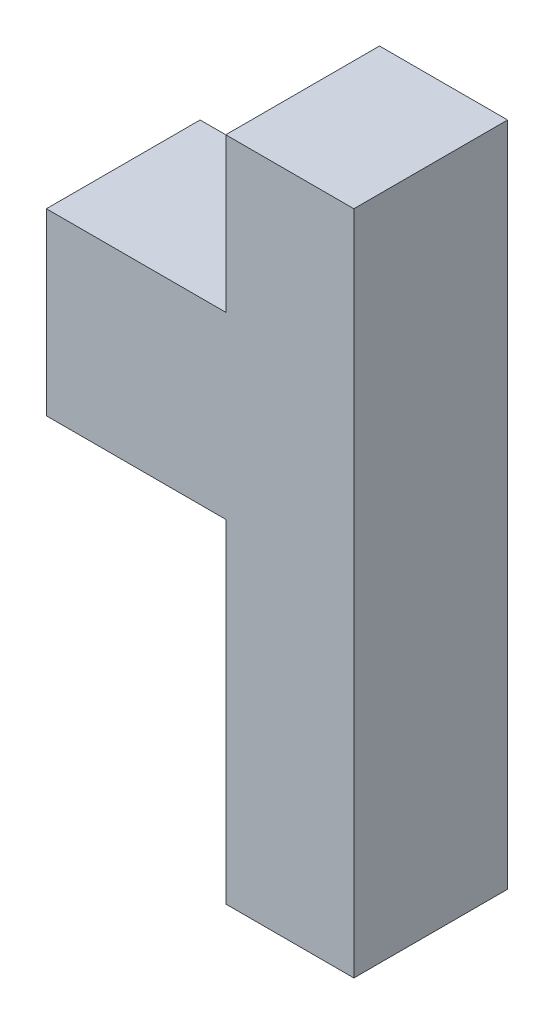
ISO-10303-21;
HEADER;
FILE_DESCRIPTION(('STEP AP214'),'2;1');
FILE_NAME('part.step','',(''),(''),'','','');
FILE_SCHEMA(('AUTOMOTIVE_DESIGN { 1 0 10303 214 1 1 1 1 }'));
ENDSEC;
DATA;
#1=APPLICATION_CONTEXT('core data for automotive mechanical design processes');
#2=APPLICATION_PROTOCOL_DEFINITION('international standard','automotive_design',2000,#1);
#3=PRODUCT_CONTEXT('',#1,'mechanical');
#4=PRODUCT('Part','Part','',(#3));
#5=PRODUCT_RELATED_PRODUCT_CATEGORY('part','',(#4));
#6=PRODUCT_DEFINITION_FORMATION('','',#4);
#7=PRODUCT_DEFINITION_CONTEXT('part definition',#1,'design');
#8=PRODUCT_DEFINITION('design','',#6,#7);
#9=PRODUCT_DEFINITION_SHAPE('','',#8);
#10=(LENGTH_UNIT() NAMED_UNIT(*) SI_UNIT(.MILLI.,.METRE.));
#11=(NAMED_UNIT(*) PLANE_ANGLE_UNIT() SI_UNIT($,.RADIAN.));
#12=(NAMED_UNIT(*) SI_UNIT($,.STERADIAN.) SOLID_ANGLE_UNIT());
#13=UNCERTAINTY_MEASURE_WITH_UNIT(LENGTH_MEASURE(1.E-05),#10,'distance_accuracy_value','');
#14=(GEOMETRIC_REPRESENTATION_CONTEXT(3) GLOBAL_UNCERTAINTY_ASSIGNED_CONTEXT((#13)) GLOBAL_UNIT_ASSIGNED_CONTEXT((#10,
#11,#12)) REPRESENTATION_CONTEXT('',''));
#15=CARTESIAN_POINT('',(0.,0.,0.));
#16=DIRECTION('',(0.,0.,1.));
#17=DIRECTION('',(1.,0.,0.));
#18=AXIS2_PLACEMENT_3D('',#15,#16,#17);
#19=CARTESIAN_POINT('',(12.5,70.,30.));
#20=DIRECTION('',(-1.,0.,0.));
#21=DIRECTION('',(0.,-1.,0.));
#22=AXIS2_PLACEMENT_3D('',#19,#20,#21);
#23=PLANE('',#22);
#24=DIRECTION('',(0.,1.,0.));
#25=VECTOR('',#24,1.);
#26=CARTESIAN_POINT('',(12.5,70.,30.));
#27=LINE('',#26,#25);
#28=CARTESIAN_POINT('',(12.5,-60.,30.));
#29=VERTEX_POINT('',#28);
#30=CARTESIAN_POINT('',(12.5,70.,30.));
#31=VERTEX_POINT('',#30);
#32=EDGE_CURVE('E191',#29,#31,#27,.T.);
#33=ORIENTED_EDGE('',*,*,#32,.F.);
#34=DIRECTION('',(0.,0.,-1.));
#35=VECTOR('',#34,1.);
#36=CARTESIAN_POINT('',(12.5,-60.,30.));
#37=LINE('',#36,#35);
#38=CARTESIAN_POINT('',(12.5,-60.,0.));
#39=VERTEX_POINT('',#38);
#40=EDGE_CURVE('E184',#29,#39,#37,.T.);
#41=ORIENTED_EDGE('',*,*,#40,.T.);
#42=DIRECTION('',(0.,1.,0.));
#43=VECTOR('',#42,1.);
#44=CARTESIAN_POINT('',(12.5,70.,0.));
#45=LINE('',#44,#43);
#46=CARTESIAN_POINT('',(12.5,70.,0.));
#47=VERTEX_POINT('',#46);
#48=EDGE_CURVE('E190',#39,#47,#45,.T.);
#49=ORIENTED_EDGE('',*,*,#48,.T.);
#50=DIRECTION('',(0.,0.,-1.));
#51=VECTOR('',#50,1.);
#52=CARTESIAN_POINT('',(12.5,70.,30.));
#53=LINE('',#52,#51);
#54=EDGE_CURVE('E235',#31,#47,#53,.T.);
#55=ORIENTED_EDGE('',*,*,#54,.F.);
#56=EDGE_LOOP('',(#33,#41,#49,#55));
#57=FACE_BOUND('',#56,.T.);
#58=ADVANCED_FACE('F33',(#57),#23,.F.);
#59=CARTESIAN_POINT('',(-12.5,70.,30.));
#60=DIRECTION('',(0.,-1.,0.));
#61=DIRECTION('',(0.,0.,-1.));
#62=AXIS2_PLACEMENT_3D('',#59,#60,#61);
#63=PLANE('',#62);
#64=DIRECTION('',(-1.,0.,0.));
#65=VECTOR('',#64,1.);
#66=CARTESIAN_POINT('',(-12.5,70.,0.));
#67=LINE('',#66,#65);
#68=CARTESIAN_POINT('',(-12.5,70.,0.));
#69=VERTEX_POINT('',#68);
#70=EDGE_CURVE('E209',#47,#69,#67,.T.);
#71=ORIENTED_EDGE('',*,*,#70,.T.);
#72=DIRECTION('',(0.,0.,-1.));
#73=VECTOR('',#72,1.);
#74=CARTESIAN_POINT('',(-12.5,70.,30.));
#75=LINE('',#74,#73);
#76=CARTESIAN_POINT('',(-12.5,70.,30.));
#77=VERTEX_POINT('',#76);
#78=EDGE_CURVE('E232',#77,#69,#75,.T.);
#79=ORIENTED_EDGE('',*,*,#78,.F.);
#80=DIRECTION('',(-1.,0.,0.));
#81=VECTOR('',#80,1.);
#82=CARTESIAN_POINT('',(-12.5,70.,30.));
#83=LINE('',#82,#81);
#84=EDGE_CURVE('E193',#31,#77,#83,.T.);
#85=ORIENTED_EDGE('',*,*,#84,.F.);
#86=ORIENTED_EDGE('',*,*,#54,.T.);
#87=EDGE_LOOP('',(#71,#79,#85,#86));
#88=FACE_BOUND('',#87,.T.);
#89=ADVANCED_FACE('F268',(#88),#63,.F.);
#90=CARTESIAN_POINT('',(-12.5,70.,30.));
#91=DIRECTION('',(1.,0.,0.));
#92=DIRECTION('',(0.,1.,0.));
#93=AXIS2_PLACEMENT_3D('',#90,#91,#92);
#94=PLANE('',#93);
#95=DIRECTION('',(0.,-1.,0.));
#96=VECTOR('',#95,1.);
#97=CARTESIAN_POINT('',(-12.5,70.,0.));
#98=LINE('',#97,#96);
#99=CARTESIAN_POINT('',(-12.5,40.,0.));
#100=VERTEX_POINT('',#99);
#101=EDGE_CURVE('E211',#69,#100,#98,.T.);
#102=ORIENTED_EDGE('',*,*,#101,.T.);
#103=DIRECTION('',(0.,0.,-1.));
#104=VECTOR('',#103,1.);
#105=CARTESIAN_POINT('',(-12.5,40.,30.));
#106=LINE('',#105,#104);
#107=CARTESIAN_POINT('',(-12.5,40.,30.));
#108=VERTEX_POINT('',#107);
#109=EDGE_CURVE('E229',#108,#100,#106,.T.);
#110=ORIENTED_EDGE('',*,*,#109,.F.);
#111=DIRECTION('',(0.,-1.,0.));
#112=VECTOR('',#111,1.);
#113=CARTESIAN_POINT('',(-12.5,70.,30.));
#114=LINE('',#113,#112);
#115=EDGE_CURVE('E196',#77,#108,#114,.T.);
#116=ORIENTED_EDGE('',*,*,#115,.F.);
#117=ORIENTED_EDGE('',*,*,#78,.T.);
#118=EDGE_LOOP('',(#102,#110,#116,#117));
#119=FACE_BOUND('',#118,.T.);
#120=ADVANCED_FACE('F274',(#119),#94,.F.);
#121=CARTESIAN_POINT('',(-47.5,40.,30.));
#122=DIRECTION('',(0.,-1.,0.));
#123=DIRECTION('',(0.,0.,-1.));
#124=AXIS2_PLACEMENT_3D('',#121,#122,#123);
#125=PLANE('',#124);
#126=DIRECTION('',(-1.,0.,0.));
#127=VECTOR('',#126,1.);
#128=CARTESIAN_POINT('',(-47.5,40.,0.));
#129=LINE('',#128,#127);
#130=CARTESIAN_POINT('',(-47.5,40.,0.));
#131=VERTEX_POINT('',#130);
#132=EDGE_CURVE('E213',#100,#131,#129,.T.);
#133=ORIENTED_EDGE('',*,*,#132,.T.);
#134=DIRECTION('',(0.,0.,-1.));
#135=VECTOR('',#134,1.);
#136=CARTESIAN_POINT('',(-47.5,40.,30.));
#137=LINE('',#136,#135);
#138=CARTESIAN_POINT('',(-47.5,40.,30.));
#139=VERTEX_POINT('',#138);
#140=EDGE_CURVE('E226',#139,#131,#137,.T.);
#141=ORIENTED_EDGE('',*,*,#140,.F.);
#142=DIRECTION('',(-1.,0.,0.));
#143=VECTOR('',#142,1.);
#144=CARTESIAN_POINT('',(-47.5,40.,30.));
#145=LINE('',#144,#143);
#146=EDGE_CURVE('E198',#108,#139,#145,.T.);
#147=ORIENTED_EDGE('',*,*,#146,.F.);
#148=ORIENTED_EDGE('',*,*,#109,.T.);
#149=EDGE_LOOP('',(#133,#141,#147,#148));
#150=FACE_BOUND('',#149,.T.);
#151=ADVANCED_FACE('F323',(#150),#125,.F.);
#152=CARTESIAN_POINT('',(-47.5,40.,30.));
#153=DIRECTION('',(1.,0.,0.));
#154=DIRECTION('',(0.,1.,0.));
#155=AXIS2_PLACEMENT_3D('',#152,#153,#154);
#156=PLANE('',#155);
#157=DIRECTION('',(0.,-1.,0.));
#158=VECTOR('',#157,1.);
#159=CARTESIAN_POINT('',(-47.5,40.,0.));
#160=LINE('',#159,#158);
#161=CARTESIAN_POINT('',(-47.5,4.99999999999999,0.));
#162=VERTEX_POINT('',#161);
#163=EDGE_CURVE('E215',#131,#162,#160,.T.);
#164=ORIENTED_EDGE('',*,*,#163,.T.);
#165=DIRECTION('',(0.,0.,-1.));
#166=VECTOR('',#165,1.);
#167=CARTESIAN_POINT('',(-47.5,4.99999999999999,30.));
#168=LINE('',#167,#166);
#169=CARTESIAN_POINT('',(-47.5,4.99999999999999,30.));
#170=VERTEX_POINT('',#169);
#171=EDGE_CURVE('E223',#170,#162,#168,.T.);
#172=ORIENTED_EDGE('',*,*,#171,.F.);
#173=DIRECTION('',(0.,-1.,0.));
#174=VECTOR('',#173,1.);
#175=CARTESIAN_POINT('',(-47.5,40.,30.));
#176=LINE('',#175,#174);
#177=EDGE_CURVE('E200',#139,#170,#176,.T.);
#178=ORIENTED_EDGE('',*,*,#177,.F.);
#179=ORIENTED_EDGE('',*,*,#140,.T.);
#180=EDGE_LOOP('',(#164,#172,#178,#179));
#181=FACE_BOUND('',#180,.T.);
#182=ADVANCED_FACE('F319',(#181),#156,.F.);
#183=CARTESIAN_POINT('',(-47.5,4.99999999999999,30.));
#184=DIRECTION('',(0.,1.,0.));
#185=DIRECTION('',(0.,0.,1.));
#186=AXIS2_PLACEMENT_3D('',#183,#184,#185);
#187=PLANE('',#186);
#188=DIRECTION('',(1.,0.,0.));
#189=VECTOR('',#188,1.);
#190=CARTESIAN_POINT('',(-47.5,4.99999999999999,0.));
#191=LINE('',#190,#189);
#192=CARTESIAN_POINT('',(-12.5,4.99999999999999,0.));
#193=VERTEX_POINT('',#192);
#194=EDGE_CURVE('E217',#162,#193,#191,.T.);
#195=ORIENTED_EDGE('',*,*,#194,.T.);
#196=DIRECTION('',(0.,0.,-1.));
#197=VECTOR('',#196,1.);
#198=CARTESIAN_POINT('',(-12.5,4.99999999999999,30.));
#199=LINE('',#198,#197);
#200=CARTESIAN_POINT('',(-12.5,4.99999999999999,30.));
#201=VERTEX_POINT('',#200);
#202=EDGE_CURVE('E207',#201,#193,#199,.T.);
#203=ORIENTED_EDGE('',*,*,#202,.F.);
#204=DIRECTION('',(1.,0.,0.));
#205=VECTOR('',#204,1.);
#206=CARTESIAN_POINT('',(-47.5,4.99999999999999,30.));
#207=LINE('',#206,#205);
#208=EDGE_CURVE('E202',#170,#201,#207,.T.);
#209=ORIENTED_EDGE('',*,*,#208,.F.);
#210=ORIENTED_EDGE('',*,*,#171,.T.);
#211=EDGE_LOOP('',(#195,#203,#209,#210));
#212=FACE_BOUND('',#211,.T.);
#213=ADVANCED_FACE('F315',(#212),#187,.F.);
#214=CARTESIAN_POINT('',(-12.5,4.99999999999999,30.));
#215=DIRECTION('',(1.,0.,0.));
#216=DIRECTION('',(0.,1.,0.));
#217=AXIS2_PLACEMENT_3D('',#214,#215,#216);
#218=PLANE('',#217);
#219=DIRECTION('',(0.,-1.,0.));
#220=VECTOR('',#219,1.);
#221=CARTESIAN_POINT('',(-12.5,4.99999999999999,0.));
#222=LINE('',#221,#220);
#223=CARTESIAN_POINT('',(-12.5,-60.,0.));
#224=VERTEX_POINT('',#223);
#225=EDGE_CURVE('E194',#193,#224,#222,.T.);
#226=ORIENTED_EDGE('',*,*,#225,.T.);
#227=DIRECTION('',(0.,0.,1.));
#228=VECTOR('',#227,1.);
#229=CARTESIAN_POINT('',(-12.5,-60.,30.));
#230=LINE('',#229,#228);
#231=CARTESIAN_POINT('',(-12.5,-60.,30.));
#232=VERTEX_POINT('',#231);
#233=EDGE_CURVE('E156',#224,#232,#230,.T.);
#234=ORIENTED_EDGE('',*,*,#233,.T.);
#235=DIRECTION('',(0.,-1.,0.));
#236=VECTOR('',#235,1.);
#237=CARTESIAN_POINT('',(-12.5,4.99999999999999,30.));
#238=LINE('',#237,#236);
#239=EDGE_CURVE('E204',#201,#232,#238,.T.);
#240=ORIENTED_EDGE('',*,*,#239,.F.);
#241=ORIENTED_EDGE('',*,*,#202,.T.);
#242=EDGE_LOOP('',(#226,#234,#240,#241));
#243=FACE_BOUND('',#242,.T.);
#244=ADVANCED_FACE('F308',(#243),#218,.F.);
#245=CARTESIAN_POINT('',(0.,0.,30.));
#246=DIRECTION('',(0.,0.,1.));
#247=DIRECTION('',(1.,0.,0.));
#248=AXIS2_PLACEMENT_3D('',#245,#246,#247);
#249=PLANE('',#248);
#250=DIRECTION('',(1.,0.,0.));
#251=VECTOR('',#250,1.);
#252=CARTESIAN_POINT('',(-12.5,-60.,30.));
#253=LINE('',#252,#251);
#254=EDGE_CURVE('E181',#232,#29,#253,.T.);
#255=ORIENTED_EDGE('',*,*,#254,.T.);
#256=ORIENTED_EDGE('',*,*,#32,.T.);
#257=ORIENTED_EDGE('',*,*,#84,.T.);
#258=ORIENTED_EDGE('',*,*,#115,.T.);
#259=ORIENTED_EDGE('',*,*,#146,.T.);
#260=ORIENTED_EDGE('',*,*,#177,.T.);
#261=ORIENTED_EDGE('',*,*,#208,.T.);
#262=ORIENTED_EDGE('',*,*,#239,.T.);
#263=EDGE_LOOP('',(#255,#256,#257,#258,#259,#260,#261,#262));
#264=FACE_BOUND('',#263,.T.);
#265=ADVANCED_FACE('F305',(#264),#249,.T.);
#266=CARTESIAN_POINT('',(0.,0.,0.));
#267=DIRECTION('',(0.,0.,1.));
#268=DIRECTION('',(1.,0.,0.));
#269=AXIS2_PLACEMENT_3D('',#266,#267,#268);
#270=PLANE('',#269);
#271=ORIENTED_EDGE('',*,*,#48,.F.);
#272=DIRECTION('',(-1.,0.,0.));
#273=VECTOR('',#272,1.);
#274=CARTESIAN_POINT('',(-12.5,-60.,0.));
#275=LINE('',#274,#273);
#276=EDGE_CURVE('E187',#39,#224,#275,.T.);
#277=ORIENTED_EDGE('',*,*,#276,.T.);
#278=ORIENTED_EDGE('',*,*,#225,.F.);
#279=ORIENTED_EDGE('',*,*,#194,.F.);
#280=ORIENTED_EDGE('',*,*,#163,.F.);
#281=ORIENTED_EDGE('',*,*,#132,.F.);
#282=ORIENTED_EDGE('',*,*,#101,.F.);
#283=ORIENTED_EDGE('',*,*,#70,.F.);
#284=EDGE_LOOP('',(#271,#277,#278,#279,#280,#281,#282,#283));
#285=FACE_BOUND('',#284,.T.);
#286=ADVANCED_FACE('F301',(#285),#270,.F.);
#287=CARTESIAN_POINT('',(0.,-60.,0.));
#288=DIRECTION('',(0.,1.,0.));
#289=DIRECTION('',(0.,0.,1.));
#290=AXIS2_PLACEMENT_3D('',#287,#288,#289);
#291=PLANE('',#290);
#292=ORIENTED_EDGE('',*,*,#233,.F.);
#293=ORIENTED_EDGE('',*,*,#276,.F.);
#294=ORIENTED_EDGE('',*,*,#40,.F.);
#295=ORIENTED_EDGE('',*,*,#254,.F.);
#296=EDGE_LOOP('',(#292,#293,#294,#295));
#297=FACE_BOUND('',#296,.T.);
#298=DIRECTION('',(-1.,0.,0.));
#299=VECTOR('',#298,1.);
#300=CARTESIAN_POINT('',(-12.5,-60.,9.99999999999999));
#301=LINE('',#300,#299);
#302=CARTESIAN_POINT('',(2.50000000000001,-60.,9.99999999999999));
#303=VERTEX_POINT('',#302);
#304=CARTESIAN_POINT('',(-2.49999999999999,-60.,9.99999999999999));
#305=VERTEX_POINT('',#304);
#306=EDGE_CURVE('E140',#303,#305,#301,.T.);
#307=ORIENTED_EDGE('',*,*,#306,.T.);
#308=DIRECTION('',(0.,0.,1.));
#309=VECTOR('',#308,1.);
#310=CARTESIAN_POINT('',(-2.49999999999999,-60.,30.));
#311=LINE('',#310,#309);
#312=CARTESIAN_POINT('',(-2.49999999999999,-60.,20.));
#313=VERTEX_POINT('',#312);
#314=EDGE_CURVE('E162',#305,#313,#311,.T.);
#315=ORIENTED_EDGE('',*,*,#314,.T.);
#316=DIRECTION('',(1.,0.,0.));
#317=VECTOR('',#316,1.);
#318=CARTESIAN_POINT('',(-12.5,-60.,20.));
#319=LINE('',#318,#317);
#320=CARTESIAN_POINT('',(2.50000000000001,-60.,20.));
#321=VERTEX_POINT('',#320);
#322=EDGE_CURVE('E143',#313,#321,#319,.T.);
#323=ORIENTED_EDGE('',*,*,#322,.T.);
#324=DIRECTION('',(0.,0.,-1.));
#325=VECTOR('',#324,1.);
#326=CARTESIAN_POINT('',(2.50000000000001,-60.,30.));
#327=LINE('',#326,#325);
#328=EDGE_CURVE('E135',#321,#303,#327,.T.);
#329=ORIENTED_EDGE('',*,*,#328,.T.);
#330=EDGE_LOOP('',(#307,#315,#323,#329));
#331=FACE_BOUND('',#330,.T.);
#332=ADVANCED_FACE('F137',(#297,#331),#291,.F.);
#333=CARTESIAN_POINT('',(2.50000000000001,-60.,30.));
#334=DIRECTION('',(-1.,0.,0.));
#335=DIRECTION('',(0.,0.,1.));
#336=AXIS2_PLACEMENT_3D('',#333,#334,#335);
#337=PLANE('',#336);
#338=CARTESIAN_POINT('',(2.50000000000001,-65.,15.));
#339=DIRECTION('',(-1.,0.,0.));
#340=DIRECTION('',(0.,0.,1.));
#341=AXIS2_PLACEMENT_3D('',#338,#339,#340);
#342=CIRCLE('',#341,2.5);
#343=CARTESIAN_POINT('',(2.50000000000001,-65.,17.5));
#344=VERTEX_POINT('',#343);
#345=EDGE_CURVE('E171',#344,#344,#342,.F.);
#346=ORIENTED_EDGE('',*,*,#345,.F.);
#347=EDGE_LOOP('',(#346));
#348=FACE_BOUND('',#347,.T.);
#349=DIRECTION('',(0.,0.,-1.));
#350=VECTOR('',#349,1.);
#351=CARTESIAN_POINT('',(2.50000000000001,-70.,30.));
#352=LINE('',#351,#350);
#353=CARTESIAN_POINT('',(2.50000000000001,-70.,19.));
#354=VERTEX_POINT('',#353);
#355=CARTESIAN_POINT('',(2.50000000000001,-70.,11.));
#356=VERTEX_POINT('',#355);
#357=EDGE_CURVE('E169',#354,#356,#352,.T.);
#358=ORIENTED_EDGE('',*,*,#357,.T.);
#359=CARTESIAN_POINT('',(2.50000000000001,-69.,11.));
#360=DIRECTION('',(-1.,0.,0.));
#361=DIRECTION('',(0.,0.,1.));
#362=AXIS2_PLACEMENT_3D('',#359,#360,#361);
#363=CIRCLE('',#362,1.);
#364=CARTESIAN_POINT('',(2.50000000000001,-69.,9.99999999999999));
#365=VERTEX_POINT('',#364);
#366=EDGE_CURVE('E41',#356,#365,#363,.F.);
#367=ORIENTED_EDGE('',*,*,#366,.T.);
#368=DIRECTION('',(0.,-1.,0.));
#369=VECTOR('',#368,1.);
#370=CARTESIAN_POINT('',(2.50000000000001,-60.,9.99999999999999));
#371=LINE('',#370,#369);
#372=EDGE_CURVE('E150',#303,#365,#371,.T.);
#373=ORIENTED_EDGE('',*,*,#372,.F.);
#374=ORIENTED_EDGE('',*,*,#328,.F.);
#375=DIRECTION('',(0.,-1.,0.));
#376=VECTOR('',#375,1.);
#377=CARTESIAN_POINT('',(2.50000000000001,-60.,20.));
#378=LINE('',#377,#376);
#379=CARTESIAN_POINT('',(2.50000000000001,-69.,20.));
#380=VERTEX_POINT('',#379);
#381=EDGE_CURVE('E168',#321,#380,#378,.T.);
#382=ORIENTED_EDGE('',*,*,#381,.T.);
#383=CARTESIAN_POINT('',(2.50000000000001,-69.,19.));
#384=DIRECTION('',(-1.,0.,0.));
#385=DIRECTION('',(0.,0.,1.));
#386=AXIS2_PLACEMENT_3D('',#383,#384,#385);
#387=CIRCLE('',#386,1.);
#388=EDGE_CURVE('E48',#380,#354,#387,.F.);
#389=ORIENTED_EDGE('',*,*,#388,.T.);
#390=EDGE_LOOP('',(#358,#367,#373,#374,#382,#389));
#391=FACE_BOUND('',#390,.T.);
#392=ADVANCED_FACE('F151',(#348,#391),#337,.F.);
#393=CARTESIAN_POINT('',(-12.5,-60.,9.99999999999999));
#394=DIRECTION('',(0.,0.,1.));
#395=DIRECTION('',(1.,0.,0.));
#396=AXIS2_PLACEMENT_3D('',#393,#394,#395);
#397=PLANE('',#396);
#398=ORIENTED_EDGE('',*,*,#372,.T.);
#399=DIRECTION('',(-1.,0.,0.));
#400=VECTOR('',#399,1.);
#401=CARTESIAN_POINT('',(-12.5,-69.,9.99999999999999));
#402=LINE('',#401,#400);
#403=CARTESIAN_POINT('',(-2.49999999999999,-69.,9.99999999999999));
#404=VERTEX_POINT('',#403);
#405=EDGE_CURVE('E238',#365,#404,#402,.T.);
#406=ORIENTED_EDGE('',*,*,#405,.T.);
#407=DIRECTION('',(0.,-1.,0.));
#408=VECTOR('',#407,1.);
#409=CARTESIAN_POINT('',(-2.49999999999999,-60.,9.99999999999999));
#410=LINE('',#409,#408);
#411=EDGE_CURVE('E157',#305,#404,#410,.T.);
#412=ORIENTED_EDGE('',*,*,#411,.F.);
#413=ORIENTED_EDGE('',*,*,#306,.F.);
#414=EDGE_LOOP('',(#398,#406,#412,#413));
#415=FACE_BOUND('',#414,.T.);
#416=ADVANCED_FACE('F159',(#415),#397,.F.);
#417=CARTESIAN_POINT('',(-2.49999999999999,-60.,30.));
#418=DIRECTION('',(1.,0.,0.));
#419=DIRECTION('',(0.,0.,-1.));
#420=AXIS2_PLACEMENT_3D('',#417,#418,#419);
#421=PLANE('',#420);
#422=CARTESIAN_POINT('',(-2.49999999999999,-65.,15.));
#423=DIRECTION('',(1.,0.,0.));
#424=DIRECTION('',(0.,0.,-1.));
#425=AXIS2_PLACEMENT_3D('',#422,#423,#424);
#426=CIRCLE('',#425,2.5);
#427=CARTESIAN_POINT('',(-2.49999999999999,-65.,12.5));
#428=VERTEX_POINT('',#427);
#429=EDGE_CURVE('E239',#428,#428,#426,.F.);
#430=ORIENTED_EDGE('',*,*,#429,.F.);
#431=EDGE_LOOP('',(#430));
#432=FACE_BOUND('',#431,.T.);
#433=ORIENTED_EDGE('',*,*,#411,.T.);
#434=CARTESIAN_POINT('',(-2.49999999999999,-69.,11.));
#435=DIRECTION('',(1.,0.,0.));
#436=DIRECTION('',(0.,0.,-1.));
#437=AXIS2_PLACEMENT_3D('',#434,#435,#436);
#438=CIRCLE('',#437,1.);
#439=CARTESIAN_POINT('',(-2.49999999999999,-70.,11.));
#440=VERTEX_POINT('',#439);
#441=EDGE_CURVE('E245',#404,#440,#438,.F.);
#442=ORIENTED_EDGE('',*,*,#441,.T.);
#443=DIRECTION('',(0.,0.,1.));
#444=VECTOR('',#443,1.);
#445=CARTESIAN_POINT('',(-2.49999999999999,-70.,30.));
#446=LINE('',#445,#444);
#447=CARTESIAN_POINT('',(-2.49999999999999,-70.,19.));
#448=VERTEX_POINT('',#447);
#449=EDGE_CURVE('E147',#440,#448,#446,.T.);
#450=ORIENTED_EDGE('',*,*,#449,.T.);
#451=CARTESIAN_POINT('',(-2.49999999999999,-69.,19.));
#452=DIRECTION('',(1.,0.,0.));
#453=DIRECTION('',(0.,0.,-1.));
#454=AXIS2_PLACEMENT_3D('',#451,#452,#453);
#455=CIRCLE('',#454,1.);
#456=CARTESIAN_POINT('',(-2.49999999999999,-69.,20.));
#457=VERTEX_POINT('',#456);
#458=EDGE_CURVE('E243',#448,#457,#455,.F.);
#459=ORIENTED_EDGE('',*,*,#458,.T.);
#460=DIRECTION('',(0.,-1.,0.));
#461=VECTOR('',#460,1.);
#462=CARTESIAN_POINT('',(-2.49999999999999,-60.,20.));
#463=LINE('',#462,#461);
#464=EDGE_CURVE('E175',#313,#457,#463,.T.);
#465=ORIENTED_EDGE('',*,*,#464,.F.);
#466=ORIENTED_EDGE('',*,*,#314,.F.);
#467=EDGE_LOOP('',(#433,#442,#450,#459,#465,#466));
#468=FACE_BOUND('',#467,.T.);
#469=ADVANCED_FACE('F253',(#432,#468),#421,.F.);
#470=CARTESIAN_POINT('',(-12.5,-60.,20.));
#471=DIRECTION('',(0.,0.,-1.));
#472=DIRECTION('',(-1.,0.,0.));
#473=AXIS2_PLACEMENT_3D('',#470,#471,#472);
#474=PLANE('',#473);
#475=ORIENTED_EDGE('',*,*,#464,.T.);
#476=DIRECTION('',(1.,0.,0.));
#477=VECTOR('',#476,1.);
#478=CARTESIAN_POINT('',(-12.5,-69.,20.));
#479=LINE('',#478,#477);
#480=EDGE_CURVE('E11',#457,#380,#479,.T.);
#481=ORIENTED_EDGE('',*,*,#480,.T.);
#482=ORIENTED_EDGE('',*,*,#381,.F.);
#483=ORIENTED_EDGE('',*,*,#322,.F.);
#484=EDGE_LOOP('',(#475,#481,#482,#483));
#485=FACE_BOUND('',#484,.T.);
#486=ADVANCED_FACE('F255',(#485),#474,.F.);
#487=CARTESIAN_POINT('',(-12.5,-70.,30.));
#488=DIRECTION('',(0.,1.,0.));
#489=DIRECTION('',(0.,0.,1.));
#490=AXIS2_PLACEMENT_3D('',#487,#488,#489);
#491=PLANE('',#490);
#492=ORIENTED_EDGE('',*,*,#449,.F.);
#493=DIRECTION('',(-1.,0.,0.));
#494=VECTOR('',#493,1.);
#495=CARTESIAN_POINT('',(-12.5,-70.,11.));
#496=LINE('',#495,#494);
#497=EDGE_CURVE('E55',#440,#356,#496,.F.);
#498=ORIENTED_EDGE('',*,*,#497,.T.);
#499=ORIENTED_EDGE('',*,*,#357,.F.);
#500=DIRECTION('',(1.,0.,0.));
#501=VECTOR('',#500,1.);
#502=CARTESIAN_POINT('',(-12.5,-70.,19.));
#503=LINE('',#502,#501);
#504=EDGE_CURVE('E247',#354,#448,#503,.F.);
#505=ORIENTED_EDGE('',*,*,#504,.T.);
#506=EDGE_LOOP('',(#492,#498,#499,#505));
#507=FACE_BOUND('',#506,.T.);
#508=ADVANCED_FACE('F250',(#507),#491,.F.);
#509=CARTESIAN_POINT('',(10.,-65.,15.));
#510=DIRECTION('',(-1.,0.,0.));
#511=DIRECTION('',(0.,0.,1.));
#512=AXIS2_PLACEMENT_3D('',#509,#510,#511);
#513=CYLINDRICAL_SURFACE('',#512,2.5);
#514=ORIENTED_EDGE('',*,*,#429,.T.);
#515=EDGE_LOOP('',(#514));
#516=FACE_BOUND('',#515,.T.);
#517=ORIENTED_EDGE('',*,*,#345,.T.);
#518=EDGE_LOOP('',(#517));
#519=FACE_BOUND('',#518,.T.);
#520=ADVANCED_FACE('F262',(#516,#519),#513,.F.);
#521=CARTESIAN_POINT('',(-12.5,-69.,11.));
#522=DIRECTION('',(-1.,0.,0.));
#523=DIRECTION('',(0.,0.,1.));
#524=AXIS2_PLACEMENT_3D('',#521,#522,#523);
#525=CYLINDRICAL_SURFACE('',#524,1.);
#526=ORIENTED_EDGE('',*,*,#366,.F.);
#527=ORIENTED_EDGE('',*,*,#497,.F.);
#528=ORIENTED_EDGE('',*,*,#441,.F.);
#529=ORIENTED_EDGE('',*,*,#405,.F.);
#530=EDGE_LOOP('',(#526,#527,#528,#529));
#531=FACE_BOUND('',#530,.T.);
#532=ADVANCED_FACE('F279',(#531),#525,.T.);
#533=CARTESIAN_POINT('',(-12.5,-69.,19.));
#534=DIRECTION('',(1.,0.,0.));
#535=DIRECTION('',(0.,0.,-1.));
#536=AXIS2_PLACEMENT_3D('',#533,#534,#535);
#537=CYLINDRICAL_SURFACE('',#536,1.);
#538=ORIENTED_EDGE('',*,*,#458,.F.);
#539=ORIENTED_EDGE('',*,*,#504,.F.);
#540=ORIENTED_EDGE('',*,*,#388,.F.);
#541=ORIENTED_EDGE('',*,*,#480,.F.);
#542=EDGE_LOOP('',(#538,#539,#540,#541));
#543=FACE_BOUND('',#542,.T.);
#544=ADVANCED_FACE('F35',(#543),#537,.T.);
#545=CLOSED_SHELL('',(#58,#89,#120,#151,#182,#213,#244,#265,#286,#332,#392,#416,#469,#486,#508,
#520,#532,#544));
#546=MANIFOLD_SOLID_BREP('B2',#545);
#547=ADVANCED_BREP_SHAPE_REPRESENTATION('',(#18,#546),#14);
#548=SHAPE_DEFINITION_REPRESENTATION(#9,#547);
ENDSEC;
END-ISO-10303-21;
